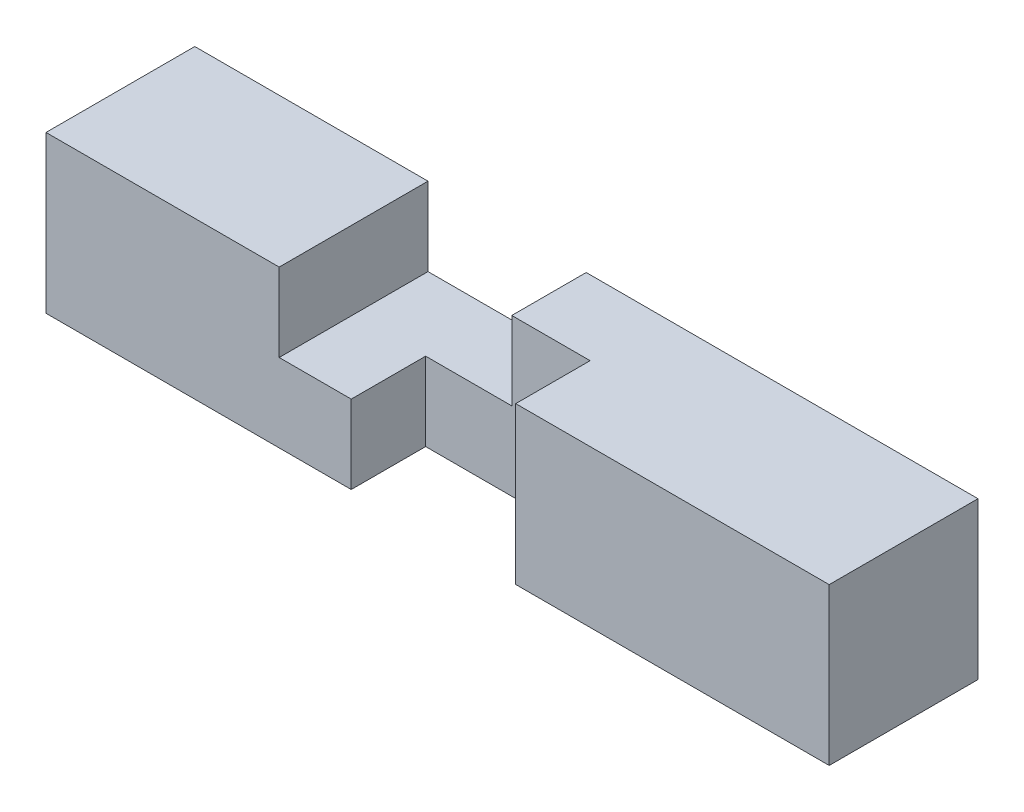
ISO-10303-21;
HEADER;
FILE_DESCRIPTION(('STEP AP214'),'2;1');
FILE_NAME('part.step','',(''),(''),'','','');
FILE_SCHEMA(('AUTOMOTIVE_DESIGN { 1 0 10303 214 1 1 1 1 }'));
ENDSEC;
DATA;
#1=APPLICATION_CONTEXT('core data for automotive mechanical design processes');
#2=APPLICATION_PROTOCOL_DEFINITION('international standard','automotive_design',2000,#1);
#3=PRODUCT_CONTEXT('',#1,'mechanical');
#4=PRODUCT('Part','Part','',(#3));
#5=PRODUCT_RELATED_PRODUCT_CATEGORY('part','',(#4));
#6=PRODUCT_DEFINITION_FORMATION('','',#4);
#7=PRODUCT_DEFINITION_CONTEXT('part definition',#1,'design');
#8=PRODUCT_DEFINITION('design','',#6,#7);
#9=PRODUCT_DEFINITION_SHAPE('','',#8);
#10=(LENGTH_UNIT() NAMED_UNIT(*) SI_UNIT(.MILLI.,.METRE.));
#11=(NAMED_UNIT(*) PLANE_ANGLE_UNIT() SI_UNIT($,.RADIAN.));
#12=(NAMED_UNIT(*) SI_UNIT($,.STERADIAN.) SOLID_ANGLE_UNIT());
#13=UNCERTAINTY_MEASURE_WITH_UNIT(LENGTH_MEASURE(1.E-05),#10,'distance_accuracy_value','');
#14=(GEOMETRIC_REPRESENTATION_CONTEXT(3) GLOBAL_UNCERTAINTY_ASSIGNED_CONTEXT((#13)) GLOBAL_UNIT_ASSIGNED_CONTEXT((#10,
#11,#12)) REPRESENTATION_CONTEXT('',''));
#15=CARTESIAN_POINT('',(0.,0.,0.));
#16=DIRECTION('',(0.,0.,1.));
#17=DIRECTION('',(1.,0.,0.));
#18=AXIS2_PLACEMENT_3D('',#15,#16,#17);
#19=CARTESIAN_POINT('',(50.,10.,19.));
#20=DIRECTION('',(-1.,0.,0.));
#21=DIRECTION('',(0.,0.,1.));
#22=AXIS2_PLACEMENT_3D('',#19,#20,#21);
#23=PLANE('',#22);
#24=DIRECTION('',(0.,1.,0.));
#25=VECTOR('',#24,1.);
#26=CARTESIAN_POINT('',(50.,10.,0.));
#27=LINE('',#26,#25);
#28=CARTESIAN_POINT('',(50.,-10.,0.));
#29=VERTEX_POINT('',#28);
#30=CARTESIAN_POINT('',(50.,10.,0.));
#31=VERTEX_POINT('',#30);
#32=EDGE_CURVE('E323',#29,#31,#27,.T.);
#33=ORIENTED_EDGE('',*,*,#32,.T.);
#34=DIRECTION('',(0.,0.,-1.));
#35=VECTOR('',#34,1.);
#36=CARTESIAN_POINT('',(50.,10.,19.));
#37=LINE('',#36,#35);
#38=CARTESIAN_POINT('',(50.,10.,19.));
#39=VERTEX_POINT('',#38);
#40=EDGE_CURVE('E11',#39,#31,#37,.T.);
#41=ORIENTED_EDGE('',*,*,#40,.F.);
#42=DIRECTION('',(0.,1.,0.));
#43=VECTOR('',#42,1.);
#44=CARTESIAN_POINT('',(50.,10.,19.));
#45=LINE('',#44,#43);
#46=CARTESIAN_POINT('',(50.,-10.,19.));
#47=VERTEX_POINT('',#46);
#48=EDGE_CURVE('E324',#47,#39,#45,.T.);
#49=ORIENTED_EDGE('',*,*,#48,.F.);
#50=DIRECTION('',(0.,0.,-1.));
#51=VECTOR('',#50,1.);
#52=CARTESIAN_POINT('',(50.,-10.,19.));
#53=LINE('',#52,#51);
#54=EDGE_CURVE('E333',#47,#29,#53,.T.);
#55=ORIENTED_EDGE('',*,*,#54,.T.);
#56=EDGE_LOOP('',(#33,#41,#49,#55));
#57=FACE_BOUND('',#56,.T.);
#58=ADVANCED_FACE('F36',(#57),#23,.F.);
#59=CARTESIAN_POINT('',(0.,0.,0.));
#60=DIRECTION('',(0.,1.,0.));
#61=DIRECTION('',(0.,0.,1.));
#62=AXIS2_PLACEMENT_3D('',#59,#60,#61);
#63=PLANE('',#62);
#64=DIRECTION('',(-1.,0.,0.));
#65=VECTOR('',#64,1.);
#66=CARTESIAN_POINT('',(-0.0256842637627146,0.,9.5));
#67=LINE('',#66,#65);
#68=CARTESIAN_POINT('',(-0.0256842637627146,0.,9.5));
#69=VERTEX_POINT('',#68);
#70=CARTESIAN_POINT('',(-11.0256842637627,0.,9.5));
#71=VERTEX_POINT('',#70);
#72=EDGE_CURVE('E278',#69,#71,#67,.T.);
#73=ORIENTED_EDGE('',*,*,#72,.F.);
#74=DIRECTION('',(0.,0.,1.));
#75=VECTOR('',#74,1.);
#76=CARTESIAN_POINT('',(-0.0256842637627146,0.,0.));
#77=LINE('',#76,#75);
#78=CARTESIAN_POINT('',(-0.0256842637627146,0.,0.));
#79=VERTEX_POINT('',#78);
#80=EDGE_CURVE('E308',#79,#69,#77,.T.);
#81=ORIENTED_EDGE('',*,*,#80,.F.);
#82=DIRECTION('',(-1.,0.,0.));
#83=VECTOR('',#82,1.);
#84=CARTESIAN_POINT('',(-10.0256842637627,0.,0.));
#85=LINE('',#84,#83);
#86=CARTESIAN_POINT('',(-20.2256842637627,0.,0.));
#87=VERTEX_POINT('',#86);
#88=EDGE_CURVE('E321',#79,#87,#85,.T.);
#89=ORIENTED_EDGE('',*,*,#88,.T.);
#90=DIRECTION('',(0.,0.,1.));
#91=VECTOR('',#90,1.);
#92=CARTESIAN_POINT('',(-20.2256842637627,0.,0.));
#93=LINE('',#92,#91);
#94=CARTESIAN_POINT('',(-20.2256842637627,0.,19.));
#95=VERTEX_POINT('',#94);
#96=EDGE_CURVE('E294',#87,#95,#93,.T.);
#97=ORIENTED_EDGE('',*,*,#96,.T.);
#98=DIRECTION('',(1.,0.,0.));
#99=VECTOR('',#98,1.);
#100=CARTESIAN_POINT('',(-10.0256842637627,0.,19.));
#101=LINE('',#100,#99);
#102=CARTESIAN_POINT('',(-11.0256842637627,0.,19.));
#103=VERTEX_POINT('',#102);
#104=EDGE_CURVE('E297',#95,#103,#101,.T.);
#105=ORIENTED_EDGE('',*,*,#104,.T.);
#106=DIRECTION('',(0.,0.,1.));
#107=VECTOR('',#106,1.);
#108=CARTESIAN_POINT('',(-11.0256842637627,0.,20.));
#109=LINE('',#108,#107);
#110=EDGE_CURVE('E283',#71,#103,#109,.T.);
#111=ORIENTED_EDGE('',*,*,#110,.F.);
#112=EDGE_LOOP('',(#73,#81,#89,#97,#105,#111));
#113=FACE_BOUND('',#112,.T.);
#114=ADVANCED_FACE('F384',(#113),#63,.T.);
#115=CARTESIAN_POINT('',(-50.,10.,19.));
#116=DIRECTION('',(0.,-1.,0.));
#117=DIRECTION('',(0.,0.,-1.));
#118=AXIS2_PLACEMENT_3D('',#115,#116,#117);
#119=PLANE('',#118);
#120=DIRECTION('',(0.,0.,-1.));
#121=VECTOR('',#120,1.);
#122=CARTESIAN_POINT('',(-0.0256842637627146,10.,0.));
#123=LINE('',#122,#121);
#124=CARTESIAN_POINT('',(-0.0256842637627146,10.,9.5));
#125=VERTEX_POINT('',#124);
#126=CARTESIAN_POINT('',(-0.0256842637627146,10.,0.));
#127=VERTEX_POINT('',#126);
#128=EDGE_CURVE('E311',#125,#127,#123,.T.);
#129=ORIENTED_EDGE('',*,*,#128,.F.);
#130=DIRECTION('',(-1.,0.,0.));
#131=VECTOR('',#130,1.);
#132=CARTESIAN_POINT('',(9.97431573623729,10.,9.5));
#133=LINE('',#132,#131);
#134=CARTESIAN_POINT('',(9.97431573623729,10.,9.5));
#135=VERTEX_POINT('',#134);
#136=EDGE_CURVE('E273',#135,#125,#133,.T.);
#137=ORIENTED_EDGE('',*,*,#136,.F.);
#138=DIRECTION('',(0.,0.,-1.));
#139=VECTOR('',#138,1.);
#140=CARTESIAN_POINT('',(9.97431573623729,10.,10.));
#141=LINE('',#140,#139);
#142=CARTESIAN_POINT('',(9.97431573623729,10.,19.));
#143=VERTEX_POINT('',#142);
#144=EDGE_CURVE('E319',#143,#135,#141,.T.);
#145=ORIENTED_EDGE('',*,*,#144,.F.);
#146=DIRECTION('',(-1.,0.,0.));
#147=VECTOR('',#146,1.);
#148=CARTESIAN_POINT('',(-50.,10.,19.));
#149=LINE('',#148,#147);
#150=EDGE_CURVE('E89',#39,#143,#149,.T.);
#151=ORIENTED_EDGE('',*,*,#150,.F.);
#152=ORIENTED_EDGE('',*,*,#40,.T.);
#153=DIRECTION('',(-1.,0.,0.));
#154=VECTOR('',#153,1.);
#155=CARTESIAN_POINT('',(-50.,10.,0.));
#156=LINE('',#155,#154);
#157=EDGE_CURVE('E337',#31,#127,#156,.T.);
#158=ORIENTED_EDGE('',*,*,#157,.T.);
#159=EDGE_LOOP('',(#129,#137,#145,#151,#152,#158));
#160=FACE_BOUND('',#159,.T.);
#161=ADVANCED_FACE('F381',(#160),#119,.F.);
#162=CARTESIAN_POINT('',(0.,0.,19.));
#163=DIRECTION('',(0.,0.,1.));
#164=DIRECTION('',(1.,0.,0.));
#165=AXIS2_PLACEMENT_3D('',#162,#163,#164);
#166=PLANE('',#165);
#167=DIRECTION('',(0.,-1.,0.));
#168=VECTOR('',#167,1.);
#169=CARTESIAN_POINT('',(-11.0256842637627,0.,19.));
#170=LINE('',#169,#168);
#171=CARTESIAN_POINT('',(-11.0256842637627,-10.,19.));
#172=VERTEX_POINT('',#171);
#173=EDGE_CURVE('E291',#103,#172,#170,.T.);
#174=ORIENTED_EDGE('',*,*,#173,.F.);
#175=ORIENTED_EDGE('',*,*,#104,.F.);
#176=DIRECTION('',(0.,1.,0.));
#177=VECTOR('',#176,1.);
#178=CARTESIAN_POINT('',(-20.2256842637627,0.,19.));
#179=LINE('',#178,#177);
#180=CARTESIAN_POINT('',(-20.2256842637627,10.,19.));
#181=VERTEX_POINT('',#180);
#182=EDGE_CURVE('E302',#95,#181,#179,.T.);
#183=ORIENTED_EDGE('',*,*,#182,.T.);
#184=CARTESIAN_POINT('',(-50.,10.,19.));
#185=VERTEX_POINT('',#184);
#186=EDGE_CURVE('E326',#181,#185,#149,.T.);
#187=ORIENTED_EDGE('',*,*,#186,.T.);
#188=DIRECTION('',(0.,-1.,0.));
#189=VECTOR('',#188,1.);
#190=CARTESIAN_POINT('',(-50.,10.,19.));
#191=LINE('',#190,#189);
#192=CARTESIAN_POINT('',(-50.,-10.,19.));
#193=VERTEX_POINT('',#192);
#194=EDGE_CURVE('E328',#185,#193,#191,.T.);
#195=ORIENTED_EDGE('',*,*,#194,.T.);
#196=DIRECTION('',(1.,0.,0.));
#197=VECTOR('',#196,1.);
#198=CARTESIAN_POINT('',(-50.,-10.,19.));
#199=LINE('',#198,#197);
#200=EDGE_CURVE('E330',#193,#172,#199,.T.);
#201=ORIENTED_EDGE('',*,*,#200,.T.);
#202=EDGE_LOOP('',(#174,#175,#183,#187,#195,#201));
#203=FACE_BOUND('',#202,.T.);
#204=ADVANCED_FACE('F371',(#203),#166,.T.);
#205=ORIENTED_EDGE('',*,*,#186,.F.);
#206=DIRECTION('',(0.,0.,1.));
#207=VECTOR('',#206,1.);
#208=CARTESIAN_POINT('',(-20.2256842637627,10.,0.));
#209=LINE('',#208,#207);
#210=CARTESIAN_POINT('',(-20.2256842637627,10.,0.));
#211=VERTEX_POINT('',#210);
#212=EDGE_CURVE('E293',#211,#181,#209,.T.);
#213=ORIENTED_EDGE('',*,*,#212,.F.);
#214=CARTESIAN_POINT('',(-50.,10.,0.));
#215=VERTEX_POINT('',#214);
#216=EDGE_CURVE('E336',#211,#215,#156,.T.);
#217=ORIENTED_EDGE('',*,*,#216,.T.);
#218=DIRECTION('',(0.,0.,-1.));
#219=VECTOR('',#218,1.);
#220=CARTESIAN_POINT('',(-50.,10.,19.));
#221=LINE('',#220,#219);
#222=EDGE_CURVE('E44',#185,#215,#221,.T.);
#223=ORIENTED_EDGE('',*,*,#222,.F.);
#224=EDGE_LOOP('',(#205,#213,#217,#223));
#225=FACE_BOUND('',#224,.T.);
#226=ADVANCED_FACE('F380',(#225),#119,.F.);
#227=CARTESIAN_POINT('',(-50.,10.,19.));
#228=DIRECTION('',(1.,0.,0.));
#229=DIRECTION('',(0.,0.,-1.));
#230=AXIS2_PLACEMENT_3D('',#227,#228,#229);
#231=PLANE('',#230);
#232=DIRECTION('',(0.,-1.,0.));
#233=VECTOR('',#232,1.);
#234=CARTESIAN_POINT('',(-50.,10.,0.));
#235=LINE('',#234,#233);
#236=CARTESIAN_POINT('',(-50.,-10.,0.));
#237=VERTEX_POINT('',#236);
#238=EDGE_CURVE('E340',#215,#237,#235,.T.);
#239=ORIENTED_EDGE('',*,*,#238,.T.);
#240=DIRECTION('',(0.,0.,-1.));
#241=VECTOR('',#240,1.);
#242=CARTESIAN_POINT('',(-50.,-10.,19.));
#243=LINE('',#242,#241);
#244=EDGE_CURVE('E344',#193,#237,#243,.T.);
#245=ORIENTED_EDGE('',*,*,#244,.F.);
#246=ORIENTED_EDGE('',*,*,#194,.F.);
#247=ORIENTED_EDGE('',*,*,#222,.T.);
#248=EDGE_LOOP('',(#239,#245,#246,#247));
#249=FACE_BOUND('',#248,.T.);
#250=ADVANCED_FACE('F350',(#249),#231,.F.);
#251=CARTESIAN_POINT('',(-50.,-10.,19.));
#252=DIRECTION('',(0.,1.,0.));
#253=DIRECTION('',(0.,0.,1.));
#254=AXIS2_PLACEMENT_3D('',#251,#252,#253);
#255=PLANE('',#254);
#256=DIRECTION('',(0.,0.,1.));
#257=VECTOR('',#256,1.);
#258=CARTESIAN_POINT('',(9.97431573623729,-10.,10.));
#259=LINE('',#258,#257);
#260=CARTESIAN_POINT('',(9.97431573623729,-10.,9.5));
#261=VERTEX_POINT('',#260);
#262=CARTESIAN_POINT('',(9.97431573623729,-10.,19.));
#263=VERTEX_POINT('',#262);
#264=EDGE_CURVE('E313',#261,#263,#259,.T.);
#265=ORIENTED_EDGE('',*,*,#264,.F.);
#266=DIRECTION('',(-1.,0.,0.));
#267=VECTOR('',#266,1.);
#268=CARTESIAN_POINT('',(-0.0256842637627146,-10.,9.5));
#269=LINE('',#268,#267);
#270=CARTESIAN_POINT('',(-11.0256842637627,-10.,9.5));
#271=VERTEX_POINT('',#270);
#272=EDGE_CURVE('E279',#261,#271,#269,.T.);
#273=ORIENTED_EDGE('',*,*,#272,.T.);
#274=DIRECTION('',(0.,0.,1.));
#275=VECTOR('',#274,1.);
#276=CARTESIAN_POINT('',(-11.0256842637627,-10.,20.));
#277=LINE('',#276,#275);
#278=EDGE_CURVE('E282',#271,#172,#277,.T.);
#279=ORIENTED_EDGE('',*,*,#278,.T.);
#280=ORIENTED_EDGE('',*,*,#200,.F.);
#281=ORIENTED_EDGE('',*,*,#244,.T.);
#282=DIRECTION('',(1.,0.,0.));
#283=VECTOR('',#282,1.);
#284=CARTESIAN_POINT('',(-50.,-10.,0.));
#285=LINE('',#284,#283);
#286=EDGE_CURVE('E82',#237,#29,#285,.T.);
#287=ORIENTED_EDGE('',*,*,#286,.T.);
#288=ORIENTED_EDGE('',*,*,#54,.F.);
#289=EDGE_CURVE('E60',#263,#47,#199,.T.);
#290=ORIENTED_EDGE('',*,*,#289,.F.);
#291=EDGE_LOOP('',(#265,#273,#279,#280,#281,#287,#288,#290));
#292=FACE_BOUND('',#291,.T.);
#293=ADVANCED_FACE('F363',(#292),#255,.F.);
#294=ORIENTED_EDGE('',*,*,#150,.T.);
#295=DIRECTION('',(0.,1.,0.));
#296=VECTOR('',#295,1.);
#297=CARTESIAN_POINT('',(9.97431573623729,-10.,19.));
#298=LINE('',#297,#296);
#299=EDGE_CURVE('E316',#263,#143,#298,.T.);
#300=ORIENTED_EDGE('',*,*,#299,.F.);
#301=ORIENTED_EDGE('',*,*,#289,.T.);
#302=ORIENTED_EDGE('',*,*,#48,.T.);
#303=EDGE_LOOP('',(#294,#300,#301,#302));
#304=FACE_BOUND('',#303,.T.);
#305=ADVANCED_FACE('F368',(#304),#166,.T.);
#306=CARTESIAN_POINT('',(0.,0.,0.));
#307=DIRECTION('',(0.,0.,1.));
#308=DIRECTION('',(1.,0.,0.));
#309=AXIS2_PLACEMENT_3D('',#306,#307,#308);
#310=PLANE('',#309);
#311=ORIENTED_EDGE('',*,*,#216,.F.);
#312=DIRECTION('',(0.,1.,0.));
#313=VECTOR('',#312,1.);
#314=CARTESIAN_POINT('',(-20.2256842637627,0.,0.));
#315=LINE('',#314,#313);
#316=EDGE_CURVE('E300',#87,#211,#315,.T.);
#317=ORIENTED_EDGE('',*,*,#316,.F.);
#318=ORIENTED_EDGE('',*,*,#88,.F.);
#319=DIRECTION('',(0.,-1.,0.));
#320=VECTOR('',#319,1.);
#321=CARTESIAN_POINT('',(-0.0256842637627146,0.,0.));
#322=LINE('',#321,#320);
#323=EDGE_CURVE('E305',#127,#79,#322,.T.);
#324=ORIENTED_EDGE('',*,*,#323,.F.);
#325=ORIENTED_EDGE('',*,*,#157,.F.);
#326=ORIENTED_EDGE('',*,*,#32,.F.);
#327=ORIENTED_EDGE('',*,*,#286,.F.);
#328=ORIENTED_EDGE('',*,*,#238,.F.);
#329=EDGE_LOOP('',(#311,#317,#318,#324,#325,#326,#327,#328));
#330=FACE_BOUND('',#329,.T.);
#331=ADVANCED_FACE('F356',(#330),#310,.F.);
#332=CARTESIAN_POINT('',(9.97431573623729,0.,0.));
#333=DIRECTION('',(1.,0.,0.));
#334=DIRECTION('',(0.,0.,-1.));
#335=AXIS2_PLACEMENT_3D('',#332,#333,#334);
#336=PLANE('',#335);
#337=ORIENTED_EDGE('',*,*,#144,.T.);
#338=DIRECTION('',(0.,-1.,0.));
#339=VECTOR('',#338,1.);
#340=CARTESIAN_POINT('',(9.97431573623729,-10.,9.5));
#341=LINE('',#340,#339);
#342=EDGE_CURVE('E270',#135,#261,#341,.T.);
#343=ORIENTED_EDGE('',*,*,#342,.T.);
#344=ORIENTED_EDGE('',*,*,#264,.T.);
#345=ORIENTED_EDGE('',*,*,#299,.T.);
#346=EDGE_LOOP('',(#337,#343,#344,#345));
#347=FACE_BOUND('',#346,.T.);
#348=ADVANCED_FACE('F366',(#347),#336,.F.);
#349=CARTESIAN_POINT('',(-0.0256842637627146,0.,0.));
#350=DIRECTION('',(1.,0.,0.));
#351=DIRECTION('',(0.,0.,-1.));
#352=AXIS2_PLACEMENT_3D('',#349,#350,#351);
#353=PLANE('',#352);
#354=ORIENTED_EDGE('',*,*,#80,.T.);
#355=DIRECTION('',(0.,-1.,0.));
#356=VECTOR('',#355,1.);
#357=CARTESIAN_POINT('',(-0.0256842637627146,-10.,9.5));
#358=LINE('',#357,#356);
#359=EDGE_CURVE('E274',#125,#69,#358,.T.);
#360=ORIENTED_EDGE('',*,*,#359,.F.);
#361=ORIENTED_EDGE('',*,*,#128,.T.);
#362=ORIENTED_EDGE('',*,*,#323,.T.);
#363=EDGE_LOOP('',(#354,#360,#361,#362));
#364=FACE_BOUND('',#363,.T.);
#365=ADVANCED_FACE('F398',(#364),#353,.F.);
#366=CARTESIAN_POINT('',(-20.2256842637627,0.,0.));
#367=DIRECTION('',(-1.,0.,0.));
#368=DIRECTION('',(0.,0.,1.));
#369=AXIS2_PLACEMENT_3D('',#366,#367,#368);
#370=PLANE('',#369);
#371=ORIENTED_EDGE('',*,*,#212,.T.);
#372=ORIENTED_EDGE('',*,*,#182,.F.);
#373=ORIENTED_EDGE('',*,*,#96,.F.);
#374=ORIENTED_EDGE('',*,*,#316,.T.);
#375=EDGE_LOOP('',(#371,#372,#373,#374));
#376=FACE_BOUND('',#375,.T.);
#377=ADVANCED_FACE('F401',(#376),#370,.F.);
#378=CARTESIAN_POINT('',(-0.0256842637627146,-10.,9.5));
#379=DIRECTION('',(0.,0.,-1.));
#380=DIRECTION('',(-1.,0.,0.));
#381=AXIS2_PLACEMENT_3D('',#378,#379,#380);
#382=PLANE('',#381);
#383=ORIENTED_EDGE('',*,*,#72,.T.);
#384=DIRECTION('',(0.,1.,0.));
#385=VECTOR('',#384,1.);
#386=CARTESIAN_POINT('',(-11.0256842637627,-10.,9.5));
#387=LINE('',#386,#385);
#388=EDGE_CURVE('E286',#271,#71,#387,.T.);
#389=ORIENTED_EDGE('',*,*,#388,.F.);
#390=ORIENTED_EDGE('',*,*,#272,.F.);
#391=ORIENTED_EDGE('',*,*,#342,.F.);
#392=ORIENTED_EDGE('',*,*,#136,.T.);
#393=ORIENTED_EDGE('',*,*,#359,.T.);
#394=EDGE_LOOP('',(#383,#389,#390,#391,#392,#393));
#395=FACE_BOUND('',#394,.T.);
#396=ADVANCED_FACE('F405',(#395),#382,.F.);
#397=CARTESIAN_POINT('',(-11.0256842637627,-10.,20.));
#398=DIRECTION('',(-1.,0.,0.));
#399=DIRECTION('',(0.,0.,1.));
#400=AXIS2_PLACEMENT_3D('',#397,#398,#399);
#401=PLANE('',#400);
#402=ORIENTED_EDGE('',*,*,#173,.T.);
#403=ORIENTED_EDGE('',*,*,#278,.F.);
#404=ORIENTED_EDGE('',*,*,#388,.T.);
#405=ORIENTED_EDGE('',*,*,#110,.T.);
#406=EDGE_LOOP('',(#402,#403,#404,#405));
#407=FACE_BOUND('',#406,.T.);
#408=ADVANCED_FACE('F409',(#407),#401,.F.);
#409=CLOSED_SHELL('',(#58,#114,#161,#204,#226,#250,#293,#305,#331,#348,#365,#377,#396,#408));
#410=CARTESIAN_POINT('',(-0.0256842637627149,-10.,7.5));
#411=DIRECTION('',(0.,0.,-1.));
#412=DIRECTION('',(-1.,0.,0.));
#413=AXIS2_PLACEMENT_3D('',#410,#411,#412);
#414=PLANE('',#413);
#415=DIRECTION('',(-1.,0.,0.));
#416=VECTOR('',#415,1.);
#417=CARTESIAN_POINT('',(0.,-1.99999999999998,7.5));
#418=LINE('',#417,#416);
#419=CARTESIAN_POINT('',(1.97431573623729,-1.99999999999998,7.5));
#420=VERTEX_POINT('',#419);
#421=CARTESIAN_POINT('',(-13.0256842637627,-1.99999999999998,7.5));
#422=VERTEX_POINT('',#421);
#423=EDGE_CURVE('E248',#420,#422,#418,.T.);
#424=ORIENTED_EDGE('',*,*,#423,.F.);
#425=DIRECTION('',(0.,-1.,0.));
#426=VECTOR('',#425,1.);
#427=CARTESIAN_POINT('',(1.97431573623729,-10.,7.5));
#428=LINE('',#427,#426);
#429=CARTESIAN_POINT('',(1.97431573623729,8.00000000000002,7.5));
#430=VERTEX_POINT('',#429);
#431=EDGE_CURVE('E262',#430,#420,#428,.T.);
#432=ORIENTED_EDGE('',*,*,#431,.F.);
#433=DIRECTION('',(-1.,0.,0.));
#434=VECTOR('',#433,1.);
#435=CARTESIAN_POINT('',(-0.0256842637627149,8.00000000000002,7.5));
#436=LINE('',#435,#434);
#437=CARTESIAN_POINT('',(11.9743157362373,8.00000000000002,7.5));
#438=VERTEX_POINT('',#437);
#439=EDGE_CURVE('E246',#438,#430,#436,.T.);
#440=ORIENTED_EDGE('',*,*,#439,.F.);
#441=DIRECTION('',(0.,-1.,0.));
#442=VECTOR('',#441,1.);
#443=CARTESIAN_POINT('',(11.9743157362373,-10.,7.5));
#444=LINE('',#443,#442);
#445=CARTESIAN_POINT('',(11.9743157362373,-8.00000000000002,7.5));
#446=VERTEX_POINT('',#445);
#447=EDGE_CURVE('E249',#438,#446,#444,.T.);
#448=ORIENTED_EDGE('',*,*,#447,.T.);
#449=DIRECTION('',(-1.,0.,0.));
#450=VECTOR('',#449,1.);
#451=CARTESIAN_POINT('',(-50.,-8.00000000000002,7.50000000000001));
#452=LINE('',#451,#450);
#453=CARTESIAN_POINT('',(-13.0256842637627,-8.00000000000002,7.5));
#454=VERTEX_POINT('',#453);
#455=EDGE_CURVE('E740',#446,#454,#452,.T.);
#456=ORIENTED_EDGE('',*,*,#455,.T.);
#457=DIRECTION('',(0.,1.,0.));
#458=VECTOR('',#457,1.);
#459=CARTESIAN_POINT('',(-13.0256842637627,-10.,7.5));
#460=LINE('',#459,#458);
#461=EDGE_CURVE('E264',#454,#422,#460,.T.);
#462=ORIENTED_EDGE('',*,*,#461,.T.);
#463=EDGE_LOOP('',(#424,#432,#440,#448,#456,#462));
#464=FACE_BOUND('',#463,.T.);
#465=ADVANCED_FACE('F418',(#464),#414,.T.);
#466=CARTESIAN_POINT('',(-13.0256842637627,-10.,20.));
#467=DIRECTION('',(-1.,0.,0.));
#468=DIRECTION('',(0.,0.,1.));
#469=AXIS2_PLACEMENT_3D('',#466,#467,#468);
#470=PLANE('',#469);
#471=DIRECTION('',(0.,-1.,0.));
#472=VECTOR('',#471,1.);
#473=CARTESIAN_POINT('',(-13.0256842637627,0.,17.));
#474=LINE('',#473,#472);
#475=CARTESIAN_POINT('',(-13.0256842637627,-1.99999999999998,17.));
#476=VERTEX_POINT('',#475);
#477=CARTESIAN_POINT('',(-13.0256842637627,-8.00000000000002,17.));
#478=VERTEX_POINT('',#477);
#479=EDGE_CURVE('E266',#476,#478,#474,.T.);
#480=ORIENTED_EDGE('',*,*,#479,.F.);
#481=DIRECTION('',(0.,0.,1.));
#482=VECTOR('',#481,1.);
#483=CARTESIAN_POINT('',(-13.0256842637627,-1.99999999999998,0.));
#484=LINE('',#483,#482);
#485=EDGE_CURVE('E741',#422,#476,#484,.T.);
#486=ORIENTED_EDGE('',*,*,#485,.F.);
#487=ORIENTED_EDGE('',*,*,#461,.F.);
#488=DIRECTION('',(0.,0.,1.));
#489=VECTOR('',#488,1.);
#490=CARTESIAN_POINT('',(-13.0256842637627,-8.00000000000002,19.));
#491=LINE('',#490,#489);
#492=EDGE_CURVE('E267',#454,#478,#491,.T.);
#493=ORIENTED_EDGE('',*,*,#492,.T.);
#494=EDGE_LOOP('',(#480,#486,#487,#493));
#495=FACE_BOUND('',#494,.T.);
#496=ADVANCED_FACE('F414',(#495),#470,.T.);
#497=CARTESIAN_POINT('',(0.,0.,17.));
#498=DIRECTION('',(0.,0.,1.));
#499=DIRECTION('',(1.,0.,0.));
#500=AXIS2_PLACEMENT_3D('',#497,#498,#499);
#501=PLANE('',#500);
#502=ORIENTED_EDGE('',*,*,#479,.T.);
#503=DIRECTION('',(1.,0.,0.));
#504=VECTOR('',#503,1.);
#505=CARTESIAN_POINT('',(-50.,-8.00000000000002,17.));
#506=LINE('',#505,#504);
#507=CARTESIAN_POINT('',(-48.,-8.00000000000002,17.));
#508=VERTEX_POINT('',#507);
#509=EDGE_CURVE('E226',#508,#478,#506,.T.);
#510=ORIENTED_EDGE('',*,*,#509,.F.);
#511=DIRECTION('',(0.,-1.,0.));
#512=VECTOR('',#511,1.);
#513=CARTESIAN_POINT('',(-48.,10.,17.));
#514=LINE('',#513,#512);
#515=CARTESIAN_POINT('',(-48.,8.00000000000002,17.));
#516=VERTEX_POINT('',#515);
#517=EDGE_CURVE('E227',#516,#508,#514,.T.);
#518=ORIENTED_EDGE('',*,*,#517,.F.);
#519=DIRECTION('',(-1.,0.,0.));
#520=VECTOR('',#519,1.);
#521=CARTESIAN_POINT('',(-50.,8.00000000000002,17.));
#522=LINE('',#521,#520);
#523=CARTESIAN_POINT('',(-22.2256842637627,8.00000000000002,17.));
#524=VERTEX_POINT('',#523);
#525=EDGE_CURVE('E238',#524,#516,#522,.T.);
#526=ORIENTED_EDGE('',*,*,#525,.F.);
#527=DIRECTION('',(0.,1.,0.));
#528=VECTOR('',#527,1.);
#529=CARTESIAN_POINT('',(-22.2256842637627,0.,17.));
#530=LINE('',#529,#528);
#531=CARTESIAN_POINT('',(-22.2256842637627,-1.99999999999998,17.));
#532=VERTEX_POINT('',#531);
#533=EDGE_CURVE('E258',#532,#524,#530,.T.);
#534=ORIENTED_EDGE('',*,*,#533,.F.);
#535=DIRECTION('',(1.,0.,0.));
#536=VECTOR('',#535,1.);
#537=CARTESIAN_POINT('',(0.,-1.99999999999998,17.));
#538=LINE('',#537,#536);
#539=EDGE_CURVE('E259',#532,#476,#538,.T.);
#540=ORIENTED_EDGE('',*,*,#539,.T.);
#541=EDGE_LOOP('',(#502,#510,#518,#526,#534,#540));
#542=FACE_BOUND('',#541,.T.);
#543=ADVANCED_FACE('F417',(#542),#501,.F.);
#544=CARTESIAN_POINT('',(11.9743157362373,0.,0.));
#545=DIRECTION('',(1.,0.,0.));
#546=DIRECTION('',(0.,0.,-1.));
#547=AXIS2_PLACEMENT_3D('',#544,#545,#546);
#548=PLANE('',#547);
#549=DIRECTION('',(0.,0.,-1.));
#550=VECTOR('',#549,1.);
#551=CARTESIAN_POINT('',(11.9743157362373,8.00000000000002,0.));
#552=LINE('',#551,#550);
#553=CARTESIAN_POINT('',(11.9743157362373,8.00000000000002,17.));
#554=VERTEX_POINT('',#553);
#555=EDGE_CURVE('E241',#554,#438,#552,.T.);
#556=ORIENTED_EDGE('',*,*,#555,.F.);
#557=DIRECTION('',(0.,1.,0.));
#558=VECTOR('',#557,1.);
#559=CARTESIAN_POINT('',(11.9743157362373,0.,17.));
#560=LINE('',#559,#558);
#561=CARTESIAN_POINT('',(11.9743157362373,-8.00000000000002,17.));
#562=VERTEX_POINT('',#561);
#563=EDGE_CURVE('E239',#562,#554,#560,.T.);
#564=ORIENTED_EDGE('',*,*,#563,.F.);
#565=DIRECTION('',(0.,0.,1.));
#566=VECTOR('',#565,1.);
#567=CARTESIAN_POINT('',(11.9743157362373,-8.00000000000002,0.));
#568=LINE('',#567,#566);
#569=EDGE_CURVE('E224',#446,#562,#568,.T.);
#570=ORIENTED_EDGE('',*,*,#569,.F.);
#571=ORIENTED_EDGE('',*,*,#447,.F.);
#572=EDGE_LOOP('',(#556,#564,#570,#571));
#573=FACE_BOUND('',#572,.T.);
#574=ADVANCED_FACE('F435',(#573),#548,.T.);
#575=CARTESIAN_POINT('',(-48.,10.,19.));
#576=DIRECTION('',(1.,0.,0.));
#577=DIRECTION('',(0.,0.,-1.));
#578=AXIS2_PLACEMENT_3D('',#575,#576,#577);
#579=PLANE('',#578);
#580=DIRECTION('',(0.,-1.,0.));
#581=VECTOR('',#580,1.);
#582=CARTESIAN_POINT('',(-48.,10.,2.));
#583=LINE('',#582,#581);
#584=CARTESIAN_POINT('',(-48.,8.00000000000002,2.));
#585=VERTEX_POINT('',#584);
#586=CARTESIAN_POINT('',(-48.,-8.00000000000002,2.));
#587=VERTEX_POINT('',#586);
#588=EDGE_CURVE('E254',#585,#587,#583,.T.);
#589=ORIENTED_EDGE('',*,*,#588,.F.);
#590=DIRECTION('',(0.,0.,-1.));
#591=VECTOR('',#590,1.);
#592=CARTESIAN_POINT('',(-48.,8.00000000000002,19.));
#593=LINE('',#592,#591);
#594=EDGE_CURVE('E276',#516,#585,#593,.T.);
#595=ORIENTED_EDGE('',*,*,#594,.F.);
#596=ORIENTED_EDGE('',*,*,#517,.T.);
#597=DIRECTION('',(0.,0.,-1.));
#598=VECTOR('',#597,1.);
#599=CARTESIAN_POINT('',(-48.,-8.00000000000002,19.));
#600=LINE('',#599,#598);
#601=EDGE_CURVE('E230',#508,#587,#600,.T.);
#602=ORIENTED_EDGE('',*,*,#601,.T.);
#603=EDGE_LOOP('',(#589,#595,#596,#602));
#604=FACE_BOUND('',#603,.T.);
#605=ADVANCED_FACE('F438',(#604),#579,.T.);
#606=CARTESIAN_POINT('',(-50.,8.00000000000002,19.));
#607=DIRECTION('',(0.,-1.,0.));
#608=DIRECTION('',(0.,0.,-1.));
#609=AXIS2_PLACEMENT_3D('',#606,#607,#608);
#610=PLANE('',#609);
#611=ORIENTED_EDGE('',*,*,#525,.T.);
#612=ORIENTED_EDGE('',*,*,#594,.T.);
#613=DIRECTION('',(-1.,0.,0.));
#614=VECTOR('',#613,1.);
#615=CARTESIAN_POINT('',(-50.,8.00000000000002,2.));
#616=LINE('',#615,#614);
#617=CARTESIAN_POINT('',(-22.2256842637627,8.00000000000002,2.));
#618=VERTEX_POINT('',#617);
#619=EDGE_CURVE('E255',#618,#585,#616,.T.);
#620=ORIENTED_EDGE('',*,*,#619,.F.);
#621=DIRECTION('',(0.,0.,1.));
#622=VECTOR('',#621,1.);
#623=CARTESIAN_POINT('',(-22.2256842637627,8.00000000000002,0.));
#624=LINE('',#623,#622);
#625=EDGE_CURVE('E723',#618,#524,#624,.T.);
#626=ORIENTED_EDGE('',*,*,#625,.T.);
#627=EDGE_LOOP('',(#611,#612,#620,#626));
#628=FACE_BOUND('',#627,.T.);
#629=ADVANCED_FACE('F428',(#628),#610,.T.);
#630=CARTESIAN_POINT('',(-22.2256842637627,0.,0.));
#631=DIRECTION('',(-1.,0.,0.));
#632=DIRECTION('',(0.,0.,1.));
#633=AXIS2_PLACEMENT_3D('',#630,#631,#632);
#634=PLANE('',#633);
#635=ORIENTED_EDGE('',*,*,#625,.F.);
#636=DIRECTION('',(0.,1.,0.));
#637=VECTOR('',#636,1.);
#638=CARTESIAN_POINT('',(-22.2256842637627,0.,2.));
#639=LINE('',#638,#637);
#640=CARTESIAN_POINT('',(-22.2256842637627,-1.99999999999998,2.));
#641=VERTEX_POINT('',#640);
#642=EDGE_CURVE('E256',#641,#618,#639,.T.);
#643=ORIENTED_EDGE('',*,*,#642,.F.);
#644=DIRECTION('',(0.,0.,1.));
#645=VECTOR('',#644,1.);
#646=CARTESIAN_POINT('',(-22.2256842637627,-1.99999999999998,0.));
#647=LINE('',#646,#645);
#648=EDGE_CURVE('E757',#641,#532,#647,.T.);
#649=ORIENTED_EDGE('',*,*,#648,.T.);
#650=ORIENTED_EDGE('',*,*,#533,.T.);
#651=EDGE_LOOP('',(#635,#643,#649,#650));
#652=FACE_BOUND('',#651,.T.);
#653=ADVANCED_FACE('F424',(#652),#634,.T.);
#654=CARTESIAN_POINT('',(0.,-1.99999999999998,0.));
#655=DIRECTION('',(0.,1.,0.));
#656=DIRECTION('',(0.,0.,1.));
#657=AXIS2_PLACEMENT_3D('',#654,#655,#656);
#658=PLANE('',#657);
#659=ORIENTED_EDGE('',*,*,#423,.T.);
#660=ORIENTED_EDGE('',*,*,#485,.T.);
#661=ORIENTED_EDGE('',*,*,#539,.F.);
#662=ORIENTED_EDGE('',*,*,#648,.F.);
#663=DIRECTION('',(-1.,0.,0.));
#664=VECTOR('',#663,1.);
#665=CARTESIAN_POINT('',(0.,-1.99999999999998,2.));
#666=LINE('',#665,#664);
#667=CARTESIAN_POINT('',(1.97431573623729,-1.99999999999998,2.));
#668=VERTEX_POINT('',#667);
#669=EDGE_CURVE('E251',#668,#641,#666,.T.);
#670=ORIENTED_EDGE('',*,*,#669,.F.);
#671=DIRECTION('',(0.,0.,1.));
#672=VECTOR('',#671,1.);
#673=CARTESIAN_POINT('',(1.97431573623729,-1.99999999999998,0.));
#674=LINE('',#673,#672);
#675=EDGE_CURVE('E245',#668,#420,#674,.T.);
#676=ORIENTED_EDGE('',*,*,#675,.T.);
#677=EDGE_LOOP('',(#659,#660,#661,#662,#670,#676));
#678=FACE_BOUND('',#677,.T.);
#679=ADVANCED_FACE('F427',(#678),#658,.F.);
#680=CARTESIAN_POINT('',(1.97431573623729,0.,0.));
#681=DIRECTION('',(1.,0.,0.));
#682=DIRECTION('',(0.,0.,-1.));
#683=AXIS2_PLACEMENT_3D('',#680,#681,#682);
#684=PLANE('',#683);
#685=ORIENTED_EDGE('',*,*,#675,.F.);
#686=DIRECTION('',(0.,-1.,0.));
#687=VECTOR('',#686,1.);
#688=CARTESIAN_POINT('',(1.97431573623729,0.,2.));
#689=LINE('',#688,#687);
#690=CARTESIAN_POINT('',(1.97431573623729,8.00000000000002,2.));
#691=VERTEX_POINT('',#690);
#692=EDGE_CURVE('E260',#691,#668,#689,.T.);
#693=ORIENTED_EDGE('',*,*,#692,.F.);
#694=DIRECTION('',(0.,0.,-1.));
#695=VECTOR('',#694,1.);
#696=CARTESIAN_POINT('',(1.97431573623729,8.00000000000002,0.));
#697=LINE('',#696,#695);
#698=EDGE_CURVE('E242',#430,#691,#697,.T.);
#699=ORIENTED_EDGE('',*,*,#698,.F.);
#700=ORIENTED_EDGE('',*,*,#431,.T.);
#701=EDGE_LOOP('',(#685,#693,#699,#700));
#702=FACE_BOUND('',#701,.T.);
#703=ADVANCED_FACE('F430',(#702),#684,.T.);
#704=CARTESIAN_POINT('',(0.,0.,2.));
#705=DIRECTION('',(0.,0.,1.));
#706=DIRECTION('',(1.,0.,0.));
#707=AXIS2_PLACEMENT_3D('',#704,#705,#706);
#708=PLANE('',#707);
#709=DIRECTION('',(1.,0.,0.));
#710=VECTOR('',#709,1.);
#711=CARTESIAN_POINT('',(-50.,-8.00000000000002,2.));
#712=LINE('',#711,#710);
#713=CARTESIAN_POINT('',(48.,-8.00000000000002,2.));
#714=VERTEX_POINT('',#713);
#715=EDGE_CURVE('E235',#587,#714,#712,.T.);
#716=ORIENTED_EDGE('',*,*,#715,.T.);
#717=DIRECTION('',(0.,1.,0.));
#718=VECTOR('',#717,1.);
#719=CARTESIAN_POINT('',(48.,8.00000000000002,2.));
#720=LINE('',#719,#718);
#721=CARTESIAN_POINT('',(48.,8.00000000000002,2.));
#722=VERTEX_POINT('',#721);
#723=EDGE_CURVE('E208',#714,#722,#720,.T.);
#724=ORIENTED_EDGE('',*,*,#723,.T.);
#725=DIRECTION('',(-1.,0.,0.));
#726=VECTOR('',#725,1.);
#727=CARTESIAN_POINT('',(-50.,8.00000000000002,2.));
#728=LINE('',#727,#726);
#729=EDGE_CURVE('E252',#722,#691,#728,.T.);
#730=ORIENTED_EDGE('',*,*,#729,.T.);
#731=ORIENTED_EDGE('',*,*,#692,.T.);
#732=ORIENTED_EDGE('',*,*,#669,.T.);
#733=ORIENTED_EDGE('',*,*,#642,.T.);
#734=ORIENTED_EDGE('',*,*,#619,.T.);
#735=ORIENTED_EDGE('',*,*,#588,.T.);
#736=EDGE_LOOP('',(#716,#724,#730,#731,#732,#733,#734,#735));
#737=FACE_BOUND('',#736,.T.);
#738=ADVANCED_FACE('F433',(#737),#708,.T.);
#739=DIRECTION('',(0.,-1.,0.));
#740=VECTOR('',#739,1.);
#741=CARTESIAN_POINT('',(48.,8.00000000000002,17.));
#742=LINE('',#741,#740);
#743=CARTESIAN_POINT('',(48.,8.00000000000002,17.));
#744=VERTEX_POINT('',#743);
#745=CARTESIAN_POINT('',(48.,-8.00000000000002,17.));
#746=VERTEX_POINT('',#745);
#747=EDGE_CURVE('E207',#744,#746,#742,.T.);
#748=ORIENTED_EDGE('',*,*,#747,.T.);
#749=DIRECTION('',(1.,0.,0.));
#750=VECTOR('',#749,1.);
#751=CARTESIAN_POINT('',(-50.,-8.00000000000002,17.));
#752=LINE('',#751,#750);
#753=EDGE_CURVE('E218',#562,#746,#752,.T.);
#754=ORIENTED_EDGE('',*,*,#753,.F.);
#755=ORIENTED_EDGE('',*,*,#563,.T.);
#756=DIRECTION('',(-1.,0.,0.));
#757=VECTOR('',#756,1.);
#758=CARTESIAN_POINT('',(-50.,8.00000000000002,17.));
#759=LINE('',#758,#757);
#760=EDGE_CURVE('E220',#744,#554,#759,.T.);
#761=ORIENTED_EDGE('',*,*,#760,.F.);
#762=EDGE_LOOP('',(#748,#754,#755,#761));
#763=FACE_BOUND('',#762,.T.);
#764=ADVANCED_FACE('F216',(#763),#501,.F.);
#765=CARTESIAN_POINT('',(-50.,-8.00000000000002,19.));
#766=DIRECTION('',(0.,1.,0.));
#767=DIRECTION('',(0.,0.,1.));
#768=AXIS2_PLACEMENT_3D('',#765,#766,#767);
#769=PLANE('',#768);
#770=ORIENTED_EDGE('',*,*,#753,.T.);
#771=DIRECTION('',(0.,0.,-1.));
#772=VECTOR('',#771,1.);
#773=CARTESIAN_POINT('',(48.,-8.00000000000002,17.));
#774=LINE('',#773,#772);
#775=EDGE_CURVE('E204',#746,#714,#774,.T.);
#776=ORIENTED_EDGE('',*,*,#775,.T.);
#777=ORIENTED_EDGE('',*,*,#715,.F.);
#778=ORIENTED_EDGE('',*,*,#601,.F.);
#779=ORIENTED_EDGE('',*,*,#509,.T.);
#780=ORIENTED_EDGE('',*,*,#492,.F.);
#781=ORIENTED_EDGE('',*,*,#455,.F.);
#782=ORIENTED_EDGE('',*,*,#569,.T.);
#783=EDGE_LOOP('',(#770,#776,#777,#778,#779,#780,#781,#782));
#784=FACE_BOUND('',#783,.T.);
#785=ADVANCED_FACE('F222',(#784),#769,.T.);
#786=ORIENTED_EDGE('',*,*,#729,.F.);
#787=DIRECTION('',(0.,0.,1.));
#788=VECTOR('',#787,1.);
#789=CARTESIAN_POINT('',(48.,8.00000000000002,17.));
#790=LINE('',#789,#788);
#791=EDGE_CURVE('E51',#722,#744,#790,.T.);
#792=ORIENTED_EDGE('',*,*,#791,.T.);
#793=ORIENTED_EDGE('',*,*,#760,.T.);
#794=ORIENTED_EDGE('',*,*,#555,.T.);
#795=ORIENTED_EDGE('',*,*,#439,.T.);
#796=ORIENTED_EDGE('',*,*,#698,.T.);
#797=EDGE_LOOP('',(#786,#792,#793,#794,#795,#796));
#798=FACE_BOUND('',#797,.T.);
#799=ADVANCED_FACE('F445',(#798),#610,.T.);
#800=CARTESIAN_POINT('',(48.,0.,0.));
#801=DIRECTION('',(1.,0.,0.));
#802=DIRECTION('',(0.,0.,-1.));
#803=AXIS2_PLACEMENT_3D('',#800,#801,#802);
#804=PLANE('',#803);
#805=ORIENTED_EDGE('',*,*,#747,.F.);
#806=ORIENTED_EDGE('',*,*,#791,.F.);
#807=ORIENTED_EDGE('',*,*,#723,.F.);
#808=ORIENTED_EDGE('',*,*,#775,.F.);
#809=EDGE_LOOP('',(#805,#806,#807,#808));
#810=FACE_BOUND('',#809,.T.);
#811=ADVANCED_FACE('F206',(#810),#804,.F.);
#812=CLOSED_SHELL('',(#465,#496,#543,#574,#605,#629,#653,#679,#703,#738,#764,#785,#799,#811));
#813=ORIENTED_CLOSED_SHELL('',*,#812,.T.);
#814=BREP_WITH_VOIDS('B2',#409,(#813));
#815=ADVANCED_BREP_SHAPE_REPRESENTATION('',(#18,#814),#14);
#816=SHAPE_DEFINITION_REPRESENTATION(#9,#815);
ENDSEC;
END-ISO-10303-21;
